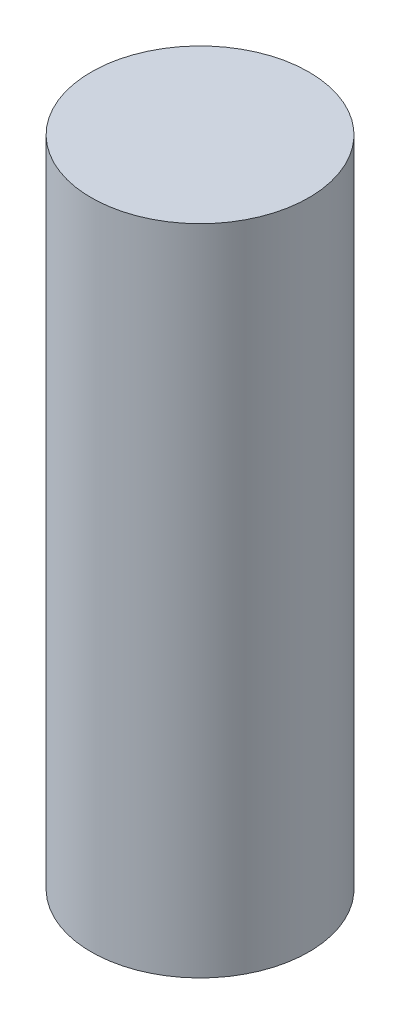
ISO-10303-21;
HEADER;
FILE_DESCRIPTION(('STEP AP214'),'2;1');
FILE_NAME('part.step','',(''),(''),'','','');
FILE_SCHEMA(('AUTOMOTIVE_DESIGN { 1 0 10303 214 1 1 1 1 }'));
ENDSEC;
DATA;
#1=APPLICATION_CONTEXT('core data for automotive mechanical design processes');
#2=APPLICATION_PROTOCOL_DEFINITION('international standard','automotive_design',2000,#1);
#3=PRODUCT_CONTEXT('',#1,'mechanical');
#4=PRODUCT('Part','Part','',(#3));
#5=PRODUCT_RELATED_PRODUCT_CATEGORY('part','',(#4));
#6=PRODUCT_DEFINITION_FORMATION('','',#4);
#7=PRODUCT_DEFINITION_CONTEXT('part definition',#1,'design');
#8=PRODUCT_DEFINITION('design','',#6,#7);
#9=PRODUCT_DEFINITION_SHAPE('','',#8);
#10=(LENGTH_UNIT() NAMED_UNIT(*) SI_UNIT(.MILLI.,.METRE.));
#11=(NAMED_UNIT(*) PLANE_ANGLE_UNIT() SI_UNIT($,.RADIAN.));
#12=(NAMED_UNIT(*) SI_UNIT($,.STERADIAN.) SOLID_ANGLE_UNIT());
#13=UNCERTAINTY_MEASURE_WITH_UNIT(LENGTH_MEASURE(1.E-05),#10,'distance_accuracy_value','');
#14=(GEOMETRIC_REPRESENTATION_CONTEXT(3) GLOBAL_UNCERTAINTY_ASSIGNED_CONTEXT((#13)) GLOBAL_UNIT_ASSIGNED_CONTEXT((#10,
#11,#12)) REPRESENTATION_CONTEXT('',''));
#15=CARTESIAN_POINT('',(0.,0.,0.));
#16=DIRECTION('',(0.,0.,1.));
#17=DIRECTION('',(1.,0.,0.));
#18=AXIS2_PLACEMENT_3D('',#15,#16,#17);
#19=CARTESIAN_POINT('',(0.,304.8,0.));
#20=DIRECTION('',(0.,-1.,0.));
#21=DIRECTION('',(0.,0.,-1.));
#22=AXIS2_PLACEMENT_3D('',#19,#20,#21);
#23=CYLINDRICAL_SURFACE('',#22,50.8);
#24=CARTESIAN_POINT('',(0.,304.8,0.));
#25=DIRECTION('',(0.,1.,0.));
#26=DIRECTION('',(0.,0.,1.));
#27=AXIS2_PLACEMENT_3D('',#24,#25,#26);
#28=CIRCLE('',#27,50.8);
#29=CARTESIAN_POINT('',(0.,304.8,-50.8));
#30=VERTEX_POINT('',#29);
#31=EDGE_CURVE('E10',#30,#30,#28,.T.);
#32=CARTESIAN_POINT('',(0.,0.,0.));
#33=DIRECTION('',(0.,1.,0.));
#34=DIRECTION('',(0.,0.,1.));
#35=AXIS2_PLACEMENT_3D('',#32,#33,#34);
#36=CIRCLE('',#35,50.8);
#37=CARTESIAN_POINT('',(0.,0.,-50.8));
#38=VERTEX_POINT('',#37);
#39=EDGE_CURVE('E40',#38,#38,#36,.T.);
#40=CARTESIAN_POINT('',(0.,304.8,-50.8));
#41=CARTESIAN_POINT('',(0.,301.625,-50.8));
#42=CARTESIAN_POINT('',(0.,298.45,-50.8));
#43=CARTESIAN_POINT('',(0.,292.1,-50.8));
#44=CARTESIAN_POINT('',(0.,288.925,-50.8));
#45=CARTESIAN_POINT('',(0.,282.575,-50.8));
#46=CARTESIAN_POINT('',(0.,279.4,-50.8));
#47=CARTESIAN_POINT('',(0.,273.05,-50.8));
#48=CARTESIAN_POINT('',(0.,269.875,-50.8));
#49=CARTESIAN_POINT('',(0.,263.525,-50.8));
#50=CARTESIAN_POINT('',(0.,260.35,-50.8));
#51=CARTESIAN_POINT('',(0.,254.,-50.8));
#52=CARTESIAN_POINT('',(0.,250.825,-50.8));
#53=CARTESIAN_POINT('',(0.,244.475,-50.8));
#54=CARTESIAN_POINT('',(0.,241.3,-50.8));
#55=CARTESIAN_POINT('',(0.,234.95,-50.8));
#56=CARTESIAN_POINT('',(0.,231.775,-50.8));
#57=CARTESIAN_POINT('',(0.,225.425,-50.8));
#58=CARTESIAN_POINT('',(0.,222.25,-50.8));
#59=CARTESIAN_POINT('',(0.,215.9,-50.8));
#60=CARTESIAN_POINT('',(0.,212.725,-50.8));
#61=CARTESIAN_POINT('',(0.,206.375,-50.8));
#62=CARTESIAN_POINT('',(0.,203.2,-50.8));
#63=CARTESIAN_POINT('',(0.,196.85,-50.8));
#64=CARTESIAN_POINT('',(0.,193.675,-50.8));
#65=CARTESIAN_POINT('',(0.,187.325,-50.8));
#66=CARTESIAN_POINT('',(0.,184.15,-50.8));
#67=CARTESIAN_POINT('',(0.,177.8,-50.8));
#68=CARTESIAN_POINT('',(0.,174.625,-50.8));
#69=CARTESIAN_POINT('',(0.,168.275,-50.8));
#70=CARTESIAN_POINT('',(0.,165.1,-50.8));
#71=CARTESIAN_POINT('',(0.,158.75,-50.8));
#72=CARTESIAN_POINT('',(0.,155.575,-50.8));
#73=CARTESIAN_POINT('',(0.,149.225,-50.8));
#74=CARTESIAN_POINT('',(0.,146.05,-50.8));
#75=CARTESIAN_POINT('',(0.,139.7,-50.8));
#76=CARTESIAN_POINT('',(0.,136.525,-50.8));
#77=CARTESIAN_POINT('',(0.,130.175,-50.8));
#78=CARTESIAN_POINT('',(0.,127.,-50.8));
#79=CARTESIAN_POINT('',(0.,120.65,-50.8));
#80=CARTESIAN_POINT('',(0.,117.475,-50.8));
#81=CARTESIAN_POINT('',(0.,111.125,-50.8));
#82=CARTESIAN_POINT('',(0.,107.95,-50.8));
#83=CARTESIAN_POINT('',(0.,101.6,-50.8));
#84=CARTESIAN_POINT('',(0.,98.425,-50.8));
#85=CARTESIAN_POINT('',(0.,92.075,-50.8));
#86=CARTESIAN_POINT('',(0.,88.9,-50.8));
#87=CARTESIAN_POINT('',(0.,82.55,-50.8));
#88=CARTESIAN_POINT('',(0.,79.375,-50.8));
#89=CARTESIAN_POINT('',(0.,73.025,-50.8));
#90=CARTESIAN_POINT('',(0.,69.85,-50.8));
#91=CARTESIAN_POINT('',(0.,63.5,-50.8));
#92=CARTESIAN_POINT('',(0.,60.325,-50.8));
#93=CARTESIAN_POINT('',(0.,53.975,-50.8));
#94=CARTESIAN_POINT('',(0.,50.8,-50.8));
#95=CARTESIAN_POINT('',(0.,44.45,-50.8));
#96=CARTESIAN_POINT('',(0.,41.275,-50.8));
#97=CARTESIAN_POINT('',(0.,34.925,-50.8));
#98=CARTESIAN_POINT('',(0.,31.75,-50.8));
#99=CARTESIAN_POINT('',(0.,25.4,-50.8));
#100=CARTESIAN_POINT('',(0.,22.225,-50.8));
#101=CARTESIAN_POINT('',(0.,15.875,-50.8));
#102=CARTESIAN_POINT('',(0.,12.7,-50.8));
#103=CARTESIAN_POINT('',(0.,6.35,-50.8));
#104=CARTESIAN_POINT('',(0.,3.175,-50.8));
#105=CARTESIAN_POINT('',(0.,0.,-50.8));
#106=B_SPLINE_CURVE_WITH_KNOTS('',3,(#40,#41,#42,#43,#44,#45,#46,#47,#48,#49,#50,#51,#52,#53,
#54,#55,#56,#57,#58,#59,#60,#61,#62,#63,#64,#65,#66,#67,#68,#69,#70,#71,#72,#73,#74,#75,#76,#77,
#78,#79,#80,#81,#82,#83,#84,#85,#86,#87,#88,#89,#90,#91,#92,#93,#94,#95,#96,#97,#98,#99,#100,
#101,#102,#103,#104,#105),.UNSPECIFIED.,.F.,.F.,(4,2,2,2,2,2,2,2,2,2,2,2,2,2,2,2,2,2,2,2,2,2,2,
2,2,2,2,2,2,2,2,2,4),(0.,9.52499999999995,19.05,28.575,38.1,47.625,57.15,66.675,76.2,85.725,
95.2499999999999,104.775,114.3,123.825,133.35,142.875,152.4,161.925,171.45,180.975,190.5,
200.025,209.55,219.075,228.6,238.125,247.65,257.175,266.7,276.225,285.75,295.275,304.8),.UNSPECIFIED.);
#107=EDGE_CURVE('BSEAM37',#30,#38,#106,.T.);
#108=ORIENTED_EDGE('',*,*,#31,.F.);
#109=ORIENTED_EDGE('',*,*,#39,.T.);
#110=ORIENTED_EDGE('',*,*,#107,.T.);
#111=ORIENTED_EDGE('',*,*,#107,.F.);
#112=EDGE_LOOP('',(#108,#110,#109,#111));
#113=FACE_BOUND('',#112,.T.);
#114=ADVANCED_FACE('F37',(#113),#23,.T.);
#115=CARTESIAN_POINT('',(0.,304.8,0.));
#116=DIRECTION('',(0.,1.,0.));
#117=DIRECTION('',(0.,0.,1.));
#118=AXIS2_PLACEMENT_3D('',#115,#116,#117);
#119=PLANE('',#118);
#120=ORIENTED_EDGE('',*,*,#31,.T.);
#121=EDGE_LOOP('',(#120));
#122=FACE_BOUND('',#121,.T.);
#123=ADVANCED_FACE('F54',(#122),#119,.T.);
#124=CARTESIAN_POINT('',(0.,0.,0.));
#125=DIRECTION('',(0.,1.,0.));
#126=DIRECTION('',(0.,0.,1.));
#127=AXIS2_PLACEMENT_3D('',#124,#125,#126);
#128=PLANE('',#127);
#129=ORIENTED_EDGE('',*,*,#39,.F.);
#130=EDGE_LOOP('',(#129));
#131=FACE_BOUND('',#130,.T.);
#132=ADVANCED_FACE('F52',(#131),#128,.F.);
#133=CLOSED_SHELL('',(#114,#123,#132));
#134=MANIFOLD_SOLID_BREP('B2',#133);
#135=ADVANCED_BREP_SHAPE_REPRESENTATION('',(#18,#134),#14);
#136=SHAPE_DEFINITION_REPRESENTATION(#9,#135);
ENDSEC;
END-ISO-10303-21;
